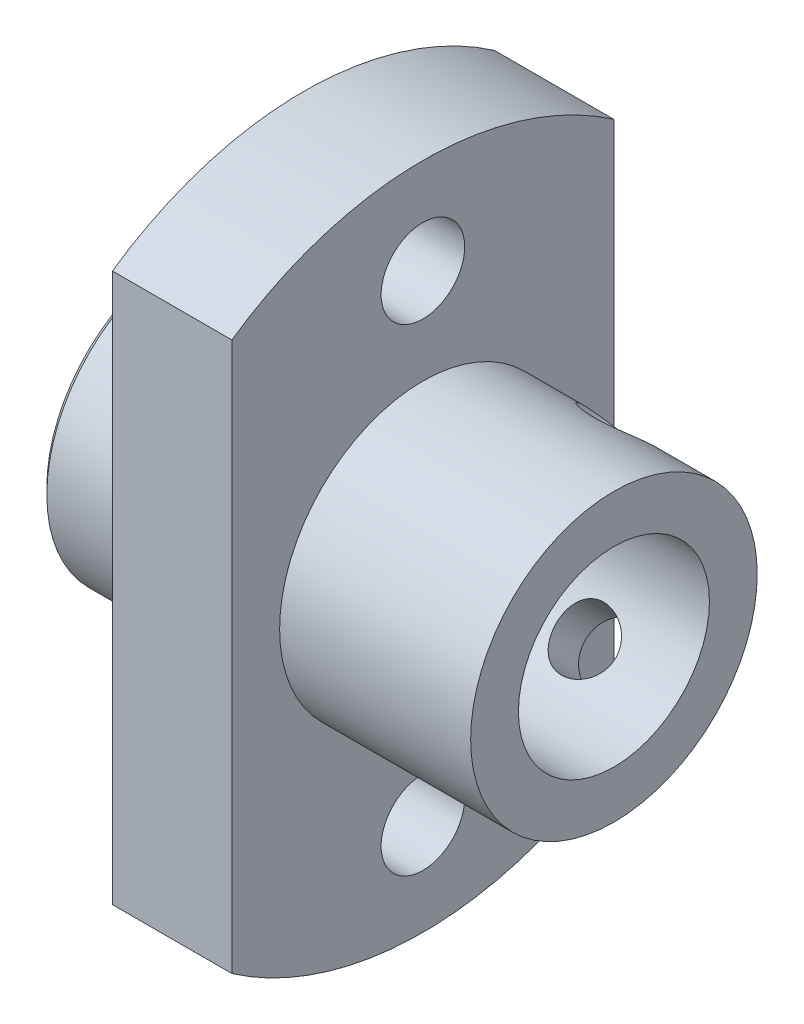
ISO-10303-21;
HEADER;
FILE_DESCRIPTION(('STEP AP214'),'2;1');
FILE_NAME('part.step','',(''),(''),'','','');
FILE_SCHEMA(('AUTOMOTIVE_DESIGN { 1 0 10303 214 1 1 1 1 }'));
ENDSEC;
DATA;
#1=APPLICATION_CONTEXT('core data for automotive mechanical design processes');
#2=APPLICATION_PROTOCOL_DEFINITION('international standard','automotive_design',2000,#1);
#3=PRODUCT_CONTEXT('',#1,'mechanical');
#4=PRODUCT('Part','Part','',(#3));
#5=PRODUCT_RELATED_PRODUCT_CATEGORY('part','',(#4));
#6=PRODUCT_DEFINITION_FORMATION('','',#4);
#7=PRODUCT_DEFINITION_CONTEXT('part definition',#1,'design');
#8=PRODUCT_DEFINITION('design','',#6,#7);
#9=PRODUCT_DEFINITION_SHAPE('','',#8);
#10=(LENGTH_UNIT() NAMED_UNIT(*) SI_UNIT(.MILLI.,.METRE.));
#11=(NAMED_UNIT(*) PLANE_ANGLE_UNIT() SI_UNIT($,.RADIAN.));
#12=(NAMED_UNIT(*) SI_UNIT($,.STERADIAN.) SOLID_ANGLE_UNIT());
#13=UNCERTAINTY_MEASURE_WITH_UNIT(LENGTH_MEASURE(1.E-05),#10,'distance_accuracy_value','');
#14=(GEOMETRIC_REPRESENTATION_CONTEXT(3) GLOBAL_UNCERTAINTY_ASSIGNED_CONTEXT((#13)) GLOBAL_UNIT_ASSIGNED_CONTEXT((#10,
#11,#12)) REPRESENTATION_CONTEXT('',''));
#15=CARTESIAN_POINT('',(0.,0.,0.));
#16=DIRECTION('',(0.,0.,1.));
#17=DIRECTION('',(1.,0.,0.));
#18=AXIS2_PLACEMENT_3D('',#15,#16,#17);
#19=CARTESIAN_POINT('',(5.,14.,0.));
#20=DIRECTION('',(1.,0.,0.));
#21=DIRECTION('',(0.,0.,-1.));
#22=AXIS2_PLACEMENT_3D('',#19,#20,#21);
#23=PLANE('',#22);
#24=CARTESIAN_POINT('',(5.,10.,0.));
#25=DIRECTION('',(1.,0.,0.));
#26=DIRECTION('',(0.,0.,-1.));
#27=AXIS2_PLACEMENT_3D('',#24,#25,#26);
#28=CIRCLE('',#27,1.75000000000001);
#29=CARTESIAN_POINT('',(5.,10.,-1.75000000000001));
#30=VERTEX_POINT('',#29);
#31=EDGE_CURVE('E209',#30,#30,#28,.T.);
#32=ORIENTED_EDGE('',*,*,#31,.T.);
#33=EDGE_LOOP('',(#32));
#34=FACE_BOUND('',#33,.T.);
#35=CARTESIAN_POINT('',(5.,-10.,0.));
#36=DIRECTION('',(1.,0.,0.));
#37=DIRECTION('',(0.,0.,-1.));
#38=AXIS2_PLACEMENT_3D('',#35,#36,#37);
#39=CIRCLE('',#38,1.75000000000001);
#40=CARTESIAN_POINT('',(5.,-10.,-1.75000000000001));
#41=VERTEX_POINT('',#40);
#42=EDGE_CURVE('E217',#41,#41,#39,.T.);
#43=ORIENTED_EDGE('',*,*,#42,.T.);
#44=EDGE_LOOP('',(#43));
#45=FACE_BOUND('',#44,.T.);
#46=CARTESIAN_POINT('',(5.,0.,0.));
#47=DIRECTION('',(-1.,0.,0.));
#48=DIRECTION('',(0.,0.,1.));
#49=AXIS2_PLACEMENT_3D('',#46,#47,#48);
#50=CIRCLE('',#49,5.75);
#51=CARTESIAN_POINT('',(5.,0.,5.75));
#52=VERTEX_POINT('',#51);
#53=EDGE_CURVE('E151',#52,#52,#50,.T.);
#54=ORIENTED_EDGE('',*,*,#53,.F.);
#55=EDGE_LOOP('',(#54));
#56=FACE_BOUND('',#55,.T.);
#57=DIRECTION('',(0.,-1.,0.));
#58=VECTOR('',#57,1.);
#59=CARTESIAN_POINT('',(5.,14.,8.00000000000001));
#60=LINE('',#59,#58);
#61=CARTESIAN_POINT('',(5.,11.4891252930761,8.));
#62=VERTEX_POINT('',#61);
#63=CARTESIAN_POINT('',(5.,-11.4891252930761,8.00000000000001));
#64=VERTEX_POINT('',#63);
#65=EDGE_CURVE('E158',#62,#64,#60,.T.);
#66=ORIENTED_EDGE('',*,*,#65,.F.);
#67=CARTESIAN_POINT('',(5.,0.,0.));
#68=DIRECTION('',(-1.,0.,0.));
#69=DIRECTION('',(0.,0.,1.));
#70=AXIS2_PLACEMENT_3D('',#67,#68,#69);
#71=CIRCLE('',#70,14.);
#72=CARTESIAN_POINT('',(5.,11.4891252930761,-8.00000000000001));
#73=VERTEX_POINT('',#72);
#74=EDGE_CURVE('E111',#62,#73,#71,.T.);
#75=ORIENTED_EDGE('',*,*,#74,.T.);
#76=DIRECTION('',(0.,-1.,0.));
#77=VECTOR('',#76,1.);
#78=CARTESIAN_POINT('',(5.,14.,-8.00000000000001));
#79=LINE('',#78,#77);
#80=CARTESIAN_POINT('',(5.,-11.4891252930761,-8.00000000000001));
#81=VERTEX_POINT('',#80);
#82=EDGE_CURVE('E117',#73,#81,#79,.T.);
#83=ORIENTED_EDGE('',*,*,#82,.T.);
#84=EDGE_CURVE('E102',#81,#64,#71,.T.);
#85=ORIENTED_EDGE('',*,*,#84,.T.);
#86=EDGE_LOOP('',(#66,#75,#83,#85));
#87=FACE_BOUND('',#86,.T.);
#88=ADVANCED_FACE('F47',(#34,#45,#56,#87),#23,.F.);
#89=CARTESIAN_POINT('',(10.,6.,0.));
#90=DIRECTION('',(-1.,0.,0.));
#91=DIRECTION('',(0.,0.,1.));
#92=AXIS2_PLACEMENT_3D('',#89,#90,#91);
#93=PLANE('',#92);
#94=CARTESIAN_POINT('',(10.,10.,0.));
#95=DIRECTION('',(1.,0.,0.));
#96=DIRECTION('',(0.,0.,-1.));
#97=AXIS2_PLACEMENT_3D('',#94,#95,#96);
#98=CIRCLE('',#97,1.75000000000001);
#99=CARTESIAN_POINT('',(10.,10.,-1.75000000000001));
#100=VERTEX_POINT('',#99);
#101=EDGE_CURVE('E204',#100,#100,#98,.T.);
#102=ORIENTED_EDGE('',*,*,#101,.F.);
#103=EDGE_LOOP('',(#102));
#104=FACE_BOUND('',#103,.T.);
#105=CARTESIAN_POINT('',(10.,-10.,0.));
#106=DIRECTION('',(1.,0.,0.));
#107=DIRECTION('',(0.,0.,-1.));
#108=AXIS2_PLACEMENT_3D('',#105,#106,#107);
#109=CIRCLE('',#108,1.75000000000001);
#110=CARTESIAN_POINT('',(10.,-10.,-1.75000000000001));
#111=VERTEX_POINT('',#110);
#112=EDGE_CURVE('E212',#111,#111,#109,.T.);
#113=ORIENTED_EDGE('',*,*,#112,.F.);
#114=EDGE_LOOP('',(#113));
#115=FACE_BOUND('',#114,.T.);
#116=CARTESIAN_POINT('',(10.,0.,0.));
#117=DIRECTION('',(-1.,0.,0.));
#118=DIRECTION('',(0.,0.,1.));
#119=AXIS2_PLACEMENT_3D('',#116,#117,#118);
#120=CIRCLE('',#119,6.);
#121=CARTESIAN_POINT('',(10.,0.,6.));
#122=VERTEX_POINT('',#121);
#123=EDGE_CURVE('E123',#122,#122,#120,.T.);
#124=ORIENTED_EDGE('',*,*,#123,.T.);
#125=EDGE_LOOP('',(#124));
#126=FACE_BOUND('',#125,.T.);
#127=CARTESIAN_POINT('',(10.,0.,0.));
#128=DIRECTION('',(-1.,0.,0.));
#129=DIRECTION('',(0.,0.,1.));
#130=AXIS2_PLACEMENT_3D('',#127,#128,#129);
#131=CIRCLE('',#130,14.);
#132=CARTESIAN_POINT('',(10.,11.4891252930761,8.00000000000001));
#133=VERTEX_POINT('',#132);
#134=CARTESIAN_POINT('',(10.,11.4891252930761,-8.00000000000001));
#135=VERTEX_POINT('',#134);
#136=EDGE_CURVE('E115',#133,#135,#131,.T.);
#137=ORIENTED_EDGE('',*,*,#136,.F.);
#138=DIRECTION('',(0.,-1.,0.));
#139=VECTOR('',#138,1.);
#140=CARTESIAN_POINT('',(10.,0.,8.00000000000001));
#141=LINE('',#140,#139);
#142=CARTESIAN_POINT('',(10.,-11.4891252930761,8.00000000000001));
#143=VERTEX_POINT('',#142);
#144=EDGE_CURVE('E92',#133,#143,#141,.T.);
#145=ORIENTED_EDGE('',*,*,#144,.T.);
#146=CARTESIAN_POINT('',(10.,-11.4891252930761,-8.00000000000001));
#147=VERTEX_POINT('',#146);
#148=EDGE_CURVE('E125',#147,#143,#131,.T.);
#149=ORIENTED_EDGE('',*,*,#148,.F.);
#150=DIRECTION('',(0.,-1.,0.));
#151=VECTOR('',#150,1.);
#152=CARTESIAN_POINT('',(10.,0.,-8.00000000000001));
#153=LINE('',#152,#151);
#154=EDGE_CURVE('E104',#135,#147,#153,.T.);
#155=ORIENTED_EDGE('',*,*,#154,.F.);
#156=EDGE_LOOP('',(#137,#145,#149,#155));
#157=FACE_BOUND('',#156,.T.);
#158=ADVANCED_FACE('F119',(#104,#115,#126,#157),#93,.F.);
#159=CARTESIAN_POINT('',(0.,0.,0.));
#160=DIRECTION('',(-1.,0.,0.));
#161=DIRECTION('',(0.,0.,1.));
#162=AXIS2_PLACEMENT_3D('',#159,#160,#161);
#163=CYLINDRICAL_SURFACE('',#162,14.);
#164=DIRECTION('',(1.,0.,0.));
#165=VECTOR('',#164,1.);
#166=CARTESIAN_POINT('',(0.,-11.4891252930761,8.00000000000001));
#167=LINE('',#166,#165);
#168=EDGE_CURVE('E98',#64,#143,#167,.T.);
#169=ORIENTED_EDGE('',*,*,#168,.F.);
#170=ORIENTED_EDGE('',*,*,#84,.F.);
#171=DIRECTION('',(1.,0.,0.));
#172=VECTOR('',#171,1.);
#173=CARTESIAN_POINT('',(0.,-11.4891252930761,-8.00000000000001));
#174=LINE('',#173,#172);
#175=EDGE_CURVE('E72',#81,#147,#174,.T.);
#176=ORIENTED_EDGE('',*,*,#175,.T.);
#177=ORIENTED_EDGE('',*,*,#148,.T.);
#178=EDGE_LOOP('',(#169,#170,#176,#177));
#179=FACE_BOUND('',#178,.T.);
#180=ADVANCED_FACE('F232',(#179),#163,.T.);
#181=CARTESIAN_POINT('',(0.,0.,0.));
#182=DIRECTION('',(-1.,0.,0.));
#183=DIRECTION('',(0.,0.,1.));
#184=AXIS2_PLACEMENT_3D('',#181,#182,#183);
#185=CYLINDRICAL_SURFACE('',#184,5.75);
#186=CARTESIAN_POINT('',(4.5,0.,0.));
#187=DIRECTION('',(-1.,0.,0.));
#188=DIRECTION('',(0.,0.,1.));
#189=AXIS2_PLACEMENT_3D('',#186,#187,#188);
#190=CIRCLE('',#189,5.75);
#191=CARTESIAN_POINT('',(4.5,0.,5.75));
#192=VERTEX_POINT('',#191);
#193=EDGE_CURVE('E150',#192,#192,#190,.T.);
#194=ORIENTED_EDGE('',*,*,#193,.F.);
#195=EDGE_LOOP('',(#194));
#196=FACE_BOUND('',#195,.T.);
#197=ORIENTED_EDGE('',*,*,#53,.T.);
#198=EDGE_LOOP('',(#197));
#199=FACE_BOUND('',#198,.T.);
#200=ADVANCED_FACE('F240',(#196,#199),#185,.T.);
#201=CARTESIAN_POINT('',(4.5,6.,0.));
#202=DIRECTION('',(-1.,0.,0.));
#203=DIRECTION('',(0.,0.,1.));
#204=AXIS2_PLACEMENT_3D('',#201,#202,#203);
#205=PLANE('',#204);
#206=CARTESIAN_POINT('',(4.5,0.,0.));
#207=DIRECTION('',(-1.,0.,0.));
#208=DIRECTION('',(0.,0.,1.));
#209=AXIS2_PLACEMENT_3D('',#206,#207,#208);
#210=CIRCLE('',#209,6.);
#211=CARTESIAN_POINT('',(4.5,0.,6.));
#212=VERTEX_POINT('',#211);
#213=EDGE_CURVE('E141',#212,#212,#210,.T.);
#214=ORIENTED_EDGE('',*,*,#213,.F.);
#215=EDGE_LOOP('',(#214));
#216=FACE_BOUND('',#215,.T.);
#217=ORIENTED_EDGE('',*,*,#193,.T.);
#218=EDGE_LOOP('',(#217));
#219=FACE_BOUND('',#218,.T.);
#220=ADVANCED_FACE('F244',(#216,#219),#205,.F.);
#221=CARTESIAN_POINT('',(0.,0.,0.));
#222=DIRECTION('',(-1.,0.,0.));
#223=DIRECTION('',(0.,0.,1.));
#224=AXIS2_PLACEMENT_3D('',#221,#222,#223);
#225=CYLINDRICAL_SURFACE('',#224,6.);
#226=CARTESIAN_POINT('',(0.25,0.,0.));
#227=DIRECTION('',(1.,0.,0.));
#228=DIRECTION('',(0.,0.,-1.));
#229=AXIS2_PLACEMENT_3D('',#226,#227,#228);
#230=CIRCLE('',#229,6.);
#231=CARTESIAN_POINT('',(0.25,0.,-6.));
#232=VERTEX_POINT('',#231);
#233=EDGE_CURVE('E164',#232,#232,#230,.T.);
#234=ORIENTED_EDGE('',*,*,#233,.T.);
#235=EDGE_LOOP('',(#234));
#236=FACE_BOUND('',#235,.T.);
#237=ORIENTED_EDGE('',*,*,#213,.T.);
#238=EDGE_LOOP('',(#237));
#239=FACE_BOUND('',#238,.T.);
#240=ADVANCED_FACE('F259',(#236,#239),#225,.T.);
#241=CARTESIAN_POINT('',(0.,6.,0.));
#242=DIRECTION('',(1.,0.,0.));
#243=DIRECTION('',(0.,0.,-1.));
#244=AXIS2_PLACEMENT_3D('',#241,#242,#243);
#245=PLANE('',#244);
#246=CARTESIAN_POINT('',(0.,0.,0.));
#247=DIRECTION('',(1.,0.,0.));
#248=DIRECTION('',(0.,0.,-1.));
#249=AXIS2_PLACEMENT_3D('',#246,#247,#248);
#250=CIRCLE('',#249,5.75);
#251=CARTESIAN_POINT('',(0.,0.,-5.75));
#252=VERTEX_POINT('',#251);
#253=EDGE_CURVE('E161',#252,#252,#250,.F.);
#254=ORIENTED_EDGE('',*,*,#253,.T.);
#255=EDGE_LOOP('',(#254));
#256=FACE_BOUND('',#255,.T.);
#257=CARTESIAN_POINT('',(0.,0.,0.));
#258=DIRECTION('',(-1.,0.,0.));
#259=DIRECTION('',(0.,0.,1.));
#260=AXIS2_PLACEMENT_3D('',#257,#258,#259);
#261=CIRCLE('',#260,4.);
#262=CARTESIAN_POINT('',(0.,0.,4.));
#263=VERTEX_POINT('',#262);
#264=EDGE_CURVE('E139',#263,#263,#261,.T.);
#265=ORIENTED_EDGE('',*,*,#264,.F.);
#266=EDGE_LOOP('',(#265));
#267=FACE_BOUND('',#266,.T.);
#268=ADVANCED_FACE('F263',(#256,#267),#245,.F.);
#269=CARTESIAN_POINT('',(0.,0.,0.));
#270=DIRECTION('',(-1.,0.,0.));
#271=DIRECTION('',(0.,0.,1.));
#272=AXIS2_PLACEMENT_3D('',#269,#270,#271);
#273=CYLINDRICAL_SURFACE('',#272,4.);
#274=CARTESIAN_POINT('',(14.,-1.80288968104244,-3.57065663400875));
#275=CARTESIAN_POINT('',(14.0683470361093,-1.80289030571911,-3.57065660503658));
#276=CARTESIAN_POINT('',(14.1366987687032,-1.80818512505603,-3.56799767532857));
#277=CARTESIAN_POINT('',(14.2713941608778,-1.82904810475375,-3.55734683774358));
#278=CARTESIAN_POINT('',(14.3377372727322,-1.84461904136233,-3.54935348868634));
#279=CARTESIAN_POINT('',(14.466444901932,-1.88511945936262,-3.52800835980024));
#280=CARTESIAN_POINT('',(14.5288162331057,-1.91003237873335,-3.51466606003217));
#281=CARTESIAN_POINT('',(14.648152695864,-1.96797357521107,-3.48255266033087));
#282=CARTESIAN_POINT('',(14.7051168699601,-2.00100328592067,-3.46378060127978));
#283=CARTESIAN_POINT('',(14.8139788674935,-2.07486710927881,-3.4200614928288));
#284=CARTESIAN_POINT('',(14.865663609436,-2.11591227360753,-3.39494031262977));
#285=CARTESIAN_POINT('',(14.9605960132092,-2.20340159015236,-3.33881998496428));
#286=CARTESIAN_POINT('',(15.0038424969448,-2.24984649480285,-3.30782001792928));
#287=CARTESIAN_POINT('',(15.0816110630112,-2.34745989554556,-3.23929961377753));
#288=CARTESIAN_POINT('',(15.1159137038315,-2.39871146718136,-3.20164756060609));
#289=CARTESIAN_POINT('',(15.1733760498555,-2.50303163514914,-3.12076610535235));
#290=CARTESIAN_POINT('',(15.1965383741496,-2.55609980125372,-3.07753801723052));
#291=CARTESIAN_POINT('',(15.2303511280971,-2.66042378700507,-2.98776381983245));
#292=CARTESIAN_POINT('',(15.2413657497878,-2.71168497913297,-2.94136134455498));
#293=CARTESIAN_POINT('',(15.2517243464375,-2.81230165697308,-2.84531055266677));
#294=CARTESIAN_POINT('',(15.2510709743588,-2.86165757333198,-2.79566297645538));
#295=CARTESIAN_POINT('',(15.238351708414,-2.95531435483259,-2.69640794179046));
#296=CARTESIAN_POINT('',(15.226680616487,-2.99973091540503,-2.64685827869325));
#297=CARTESIAN_POINT('',(15.192905009957,-3.08436293146338,-2.5477352629929));
#298=CARTESIAN_POINT('',(15.1707998149134,-3.12457811275522,-2.49816190905547));
#299=CARTESIAN_POINT('',(15.1165298109251,-3.20058640425909,-2.40003107341511));
#300=CARTESIAN_POINT('',(15.084245191437,-3.23631936757298,-2.3514934512199));
#301=CARTESIAN_POINT('',(15.0106289002954,-3.30241475894965,-2.25773164911935));
#302=CARTESIAN_POINT('',(14.9692949408622,-3.33277582541756,-2.21250831097));
#303=CARTESIAN_POINT('',(14.8767263651987,-3.389144704395,-2.12520873003737));
#304=CARTESIAN_POINT('',(14.8251509311588,-3.41491836698349,-2.08334218337763));
#305=CARTESIAN_POINT('',(14.7146048981755,-3.46050697518938,-2.00670993923054));
#306=CARTESIAN_POINT('',(14.655633429425,-3.48032121901926,-1.97194507819979));
#307=CARTESIAN_POINT('',(14.5310825311402,-3.51425926671764,-1.91081735332639));
#308=CARTESIAN_POINT('',(14.4654365909576,-3.52831696946609,-1.88455277719453));
#309=CARTESIAN_POINT('',(14.3299405081046,-3.55049551670868,-1.84243176789487));
#310=CARTESIAN_POINT('',(14.2600918857895,-3.55861849432836,-1.82657159526906));
#311=CARTESIAN_POINT('',(14.1211800474342,-3.5687753392117,-1.80664423679707));
#312=CARTESIAN_POINT('',(14.0521980037679,-3.57104071252129,-1.80212889210537));
#313=CARTESIAN_POINT('',(13.9144102585018,-3.57016673715856,-1.80386003750099));
#314=CARTESIAN_POINT('',(13.8456045312995,-3.56702822361113,-1.81010486469508));
#315=CARTESIAN_POINT('',(13.7121917033484,-3.55550140639484,-1.83263752282806));
#316=CARTESIAN_POINT('',(13.647520725926,-3.54726753164827,-1.84862972536123));
#317=CARTESIAN_POINT('',(13.521978208004,-3.52564615598807,-1.88953720131367));
#318=CARTESIAN_POINT('',(13.4611072890788,-3.51225781451319,-1.91445393004796));
#319=CARTESIAN_POINT('',(13.3429608902283,-3.4798001051782,-1.97284933775562));
#320=CARTESIAN_POINT('',(13.2858385844072,-3.46057882627758,-2.00655306632047));
#321=CARTESIAN_POINT('',(13.1785096536381,-3.41653483389054,-2.08065963963097));
#322=CARTESIAN_POINT('',(13.1283048310747,-3.39171066497126,-2.12106422429772));
#323=CARTESIAN_POINT('',(13.0340896340872,-3.33529174721352,-2.20876748108082));
#324=CARTESIAN_POINT('',(12.9904222138601,-3.30345903684159,-2.25628247243922));
#325=CARTESIAN_POINT('',(12.9131089566787,-3.23384124277099,-2.35497603855302));
#326=CARTESIAN_POINT('',(12.879462660689,-3.19605643184015,-2.40615444536592));
#327=CARTESIAN_POINT('',(12.8234694375283,-3.1152781728554,-2.50984553563265));
#328=CARTESIAN_POINT('',(12.8010407121563,-3.07232535134571,-2.56234553800171));
#329=CARTESIAN_POINT('',(12.7679274614103,-2.98184078610164,-2.66709729901053));
#330=CARTESIAN_POINT('',(12.7572392609165,-2.93431048032078,-2.71934913023257));
#331=CARTESIAN_POINT('',(12.7482089982504,-2.83800345116101,-2.81963997764553));
#332=CARTESIAN_POINT('',(12.7493715498292,-2.78936096151418,-2.86776381865191));
#333=CARTESIAN_POINT('',(12.7628118110487,-2.6904964427738,-2.96071478462393));
#334=CARTESIAN_POINT('',(12.775088795992,-2.64027451687073,-3.00554212432618));
#335=CARTESIAN_POINT('',(12.8100940092223,-2.54052194488809,-3.09030470588553));
#336=CARTESIAN_POINT('',(12.8326896078454,-2.49099050870454,-3.13029411952677));
#337=CARTESIAN_POINT('',(12.8875708272085,-2.39361375144726,-3.20537010957023));
#338=CARTESIAN_POINT('',(12.9198581099734,-2.34576872114874,-3.24045584352771));
#339=CARTESIAN_POINT('',(12.9944727583444,-2.25180790129064,-3.30647420461506));
#340=CARTESIAN_POINT('',(13.037103522464,-2.20580580858097,-3.33722560024325));
#341=CARTESIAN_POINT('',(13.1306598894435,-2.11903396615902,-3.39298694662355));
#342=CARTESIAN_POINT('',(13.1815879741394,-2.07826578852223,-3.41799517411017));
#343=CARTESIAN_POINT('',(13.2923157198411,-2.00237810045469,-3.46301839777919));
#344=CARTESIAN_POINT('',(13.3523534031166,-1.96749048567916,-3.48284051265675));
#345=CARTESIAN_POINT('',(13.4783981202691,-1.90678170331302,-3.51644623739546));
#346=CARTESIAN_POINT('',(13.5444027264503,-1.8809568691413,-3.53023228986131));
#347=CARTESIAN_POINT('',(13.6747226173147,-1.84155623262106,-3.55093285934443));
#348=CARTESIAN_POINT('',(13.7387025474516,-1.8271241492854,-3.55833283084341));
#349=CARTESIAN_POINT('',(13.8684538320965,-1.80779174707742,-3.56819412374839));
#350=CARTESIAN_POINT('',(13.9342247412015,-1.80288907987124,-3.57065666189075));
#351=CARTESIAN_POINT('',(14.,-1.80288968104244,-3.57065663400875));
#352=B_SPLINE_CURVE_WITH_KNOTS('',3,(#274,#275,#276,#277,#278,#279,#280,#281,#282,#283,#284,
#285,#286,#287,#288,#289,#290,#291,#292,#293,#294,#295,#296,#297,#298,#299,#300,#301,#302,#303,
#304,#305,#306,#307,#308,#309,#310,#311,#312,#313,#314,#315,#316,#317,#318,#319,#320,#321,#322,
#323,#324,#325,#326,#327,#328,#329,#330,#331,#332,#333,#334,#335,#336,#337,#338,#339,#340,#341,
#342,#343,#344,#345,#346,#347,#348,#349,#350,#351),.UNSPECIFIED.,.T.,.F.,(4,2,2,2,2,2,2,2,2,2,2,
2,2,2,2,2,2,2,2,2,2,2,2,2,2,2,2,2,2,2,2,2,2,2,2,2,2,2,4),(0.,0.204798137548489,
0.409651627059734,0.614143644118575,0.818671804924945,1.02957080550838,1.24049922941122,
1.45619821963732,1.67184647417921,1.88083722835533,2.08978046471773,2.29150982969749,
2.49325235190092,2.69746404608408,2.90172742713186,3.11450338937332,3.32730439853774,
3.54248470934453,3.75758763952751,3.96404933287934,4.17047912219087,4.37093972044361,
4.57143302253208,4.77767613309608,4.98397288011878,5.19881937811509,5.41365603317084,
5.62690239290995,5.84008198140582,6.04438802439522,6.24868074692303,6.45041846514756,
6.65219079911649,6.86080693105212,7.06948557772187,7.28507795501701,7.50058300803818,
7.69772354371382,7.89481549188775),.UNSPECIFIED.);
#353=CARTESIAN_POINT('',(14.,-1.80288968104244,-3.57065663400875));
#354=VERTEX_POINT('',#353);
#355=EDGE_CURVE('E307',#354,#354,#352,.T.);
#356=ORIENTED_EDGE('',*,*,#355,.T.);
#357=EDGE_LOOP('',(#356));
#358=FACE_BOUND('',#357,.T.);
#359=CARTESIAN_POINT('',(14.,3.57065663400877,-1.80288968104239));
#360=CARTESIAN_POINT('',(14.0683470361093,3.5706566050366,-1.80289030571907));
#361=CARTESIAN_POINT('',(14.1366987687032,3.5679976753286,-1.80818512505599));
#362=CARTESIAN_POINT('',(14.2713941608778,3.5573468377436,-1.8290481047537));
#363=CARTESIAN_POINT('',(14.3377372727322,3.54935348868636,-1.84461904136229));
#364=CARTESIAN_POINT('',(14.466444901932,3.52800835980026,-1.88511945936258));
#365=CARTESIAN_POINT('',(14.5288162331057,3.51466606003219,-1.91003237873331));
#366=CARTESIAN_POINT('',(14.648152695864,3.4825526603309,-1.96797357521103));
#367=CARTESIAN_POINT('',(14.7051168699601,3.4637806012798,-2.00100328592063));
#368=CARTESIAN_POINT('',(14.8139788674935,3.42006149282882,-2.07486710927877));
#369=CARTESIAN_POINT('',(14.865663609436,3.39494031262979,-2.11591227360748));
#370=CARTESIAN_POINT('',(14.9605960132092,3.33881998496431,-2.20340159015232));
#371=CARTESIAN_POINT('',(15.0038424969448,3.30782001792931,-2.24984649480281));
#372=CARTESIAN_POINT('',(15.0816110630112,3.23929961377756,-2.34745989554552));
#373=CARTESIAN_POINT('',(15.1159137038315,3.20164756060612,-2.39871146718132));
#374=CARTESIAN_POINT('',(15.1733760498555,3.12076610535238,-2.50303163514911));
#375=CARTESIAN_POINT('',(15.1965383741496,3.07753801723056,-2.55609980125368));
#376=CARTESIAN_POINT('',(15.2303511280971,2.98776381983248,-2.66042378700504));
#377=CARTESIAN_POINT('',(15.2413657497878,2.94136134455501,-2.71168497913294));
#378=CARTESIAN_POINT('',(15.2517243464375,2.8453105526668,-2.81230165697305));
#379=CARTESIAN_POINT('',(15.2510709743588,2.79566297645541,-2.86165757333195));
#380=CARTESIAN_POINT('',(15.238351708414,2.6964079417905,-2.95531435483255));
#381=CARTESIAN_POINT('',(15.226680616487,2.64685827869328,-2.999730915405));
#382=CARTESIAN_POINT('',(15.192905009957,2.54773526299293,-3.08436293146335));
#383=CARTESIAN_POINT('',(15.1707998149134,2.49816190905551,-3.12457811275519));
#384=CARTESIAN_POINT('',(15.1165298109251,2.40003107341515,-3.20058640425906));
#385=CARTESIAN_POINT('',(15.084245191437,2.35149345121994,-3.23631936757295));
#386=CARTESIAN_POINT('',(15.0106289002954,2.25773164911939,-3.30241475894962));
#387=CARTESIAN_POINT('',(14.9692949408622,2.21250831097004,-3.33277582541754));
#388=CARTESIAN_POINT('',(14.8767263651987,2.12520873003741,-3.38914470439498));
#389=CARTESIAN_POINT('',(14.8251509311588,2.08334218337767,-3.41491836698347));
#390=CARTESIAN_POINT('',(14.7146048981755,2.00670993923058,-3.46050697518936));
#391=CARTESIAN_POINT('',(14.655633429425,1.97194507819983,-3.48032121901924));
#392=CARTESIAN_POINT('',(14.5310825311402,1.91081735332643,-3.51425926671762));
#393=CARTESIAN_POINT('',(14.4654365909576,1.88455277719457,-3.52831696946606));
#394=CARTESIAN_POINT('',(14.3299405081046,1.84243176789491,-3.55049551670866));
#395=CARTESIAN_POINT('',(14.2600918857895,1.82657159526911,-3.55861849432834));
#396=CARTESIAN_POINT('',(14.1211800474342,1.80664423679711,-3.56877533921168));
#397=CARTESIAN_POINT('',(14.0521980037679,1.80212889210542,-3.57104071252127));
#398=CARTESIAN_POINT('',(13.9144102585018,1.80386003750103,-3.57016673715854));
#399=CARTESIAN_POINT('',(13.8456045312995,1.81010486469512,-3.56702822361111));
#400=CARTESIAN_POINT('',(13.7121917033484,1.8326375228281,-3.55550140639482));
#401=CARTESIAN_POINT('',(13.647520725926,1.84862972536128,-3.54726753164824));
#402=CARTESIAN_POINT('',(13.521978208004,1.88953720131372,-3.52564615598805));
#403=CARTESIAN_POINT('',(13.4611072890788,1.914453930048,-3.51225781451317));
#404=CARTESIAN_POINT('',(13.3429608902283,1.97284933775566,-3.47980010517817));
#405=CARTESIAN_POINT('',(13.2858385844072,2.00655306632051,-3.46057882627756));
#406=CARTESIAN_POINT('',(13.1785096536381,2.08065963963101,-3.41653483389052));
#407=CARTESIAN_POINT('',(13.1283048310747,2.12106422429776,-3.39171066497124));
#408=CARTESIAN_POINT('',(13.0340896340872,2.20876748108086,-3.3352917472135));
#409=CARTESIAN_POINT('',(12.9904222138601,2.25628247243926,-3.30345903684156));
#410=CARTESIAN_POINT('',(12.9131089566787,2.35497603855306,-3.23384124277097));
#411=CARTESIAN_POINT('',(12.879462660689,2.40615444536596,-3.19605643184012));
#412=CARTESIAN_POINT('',(12.8234694375283,2.50984553563269,-3.11527817285537));
#413=CARTESIAN_POINT('',(12.8010407121563,2.56234553800175,-3.07232535134568));
#414=CARTESIAN_POINT('',(12.7679274614103,2.66709729901057,-2.9818407861016));
#415=CARTESIAN_POINT('',(12.7572392609165,2.71934913023261,-2.93431048032075));
#416=CARTESIAN_POINT('',(12.7482089982504,2.81963997764557,-2.83800345116097));
#417=CARTESIAN_POINT('',(12.7493715498292,2.86776381865194,-2.78936096151415));
#418=CARTESIAN_POINT('',(12.7628118110487,2.96071478462396,-2.69049644277376));
#419=CARTESIAN_POINT('',(12.775088795992,3.00554212432621,-2.64027451687069));
#420=CARTESIAN_POINT('',(12.8100940092223,3.09030470588556,-2.54052194488805));
#421=CARTESIAN_POINT('',(12.8326896078454,3.1302941195268,-2.4909905087045));
#422=CARTESIAN_POINT('',(12.8875708272085,3.20537010957026,-2.39361375144722));
#423=CARTESIAN_POINT('',(12.9198581099734,3.24045584352774,-2.3457687211487));
#424=CARTESIAN_POINT('',(12.9944727583444,3.30647420461509,-2.2518079012906));
#425=CARTESIAN_POINT('',(13.037103522464,3.33722560024328,-2.20580580858093));
#426=CARTESIAN_POINT('',(13.1306598894435,3.39298694662357,-2.11903396615898));
#427=CARTESIAN_POINT('',(13.1815879741394,3.4179951741102,-2.07826578852219));
#428=CARTESIAN_POINT('',(13.2923157198411,3.46301839777921,-2.00237810045465));
#429=CARTESIAN_POINT('',(13.3523534031166,3.48284051265678,-1.96749048567912));
#430=CARTESIAN_POINT('',(13.4783981202691,3.51644623739548,-1.90678170331298));
#431=CARTESIAN_POINT('',(13.5444027264503,3.53023228986134,-1.88095686914125));
#432=CARTESIAN_POINT('',(13.6747226173147,3.55093285934446,-1.84155623262102));
#433=CARTESIAN_POINT('',(13.7387025474516,3.55833283084343,-1.82712414928535));
#434=CARTESIAN_POINT('',(13.8684538320965,3.56819412374841,-1.80779174707738));
#435=CARTESIAN_POINT('',(13.9342247412015,3.57065666189077,-1.80288907987119));
#436=CARTESIAN_POINT('',(14.,3.57065663400877,-1.80288968104239));
#437=B_SPLINE_CURVE_WITH_KNOTS('',3,(#359,#360,#361,#362,#363,#364,#365,#366,#367,#368,#369,
#370,#371,#372,#373,#374,#375,#376,#377,#378,#379,#380,#381,#382,#383,#384,#385,#386,#387,#388,
#389,#390,#391,#392,#393,#394,#395,#396,#397,#398,#399,#400,#401,#402,#403,#404,#405,#406,#407,
#408,#409,#410,#411,#412,#413,#414,#415,#416,#417,#418,#419,#420,#421,#422,#423,#424,#425,#426,
#427,#428,#429,#430,#431,#432,#433,#434,#435,#436),.UNSPECIFIED.,.T.,.F.,(4,2,2,2,2,2,2,2,2,2,2,
2,2,2,2,2,2,2,2,2,2,2,2,2,2,2,2,2,2,2,2,2,2,2,2,2,2,2,4),(0.,0.204798137548489,
0.409651627059734,0.614143644118578,0.818671804924944,1.02957080550838,1.24049922941122,
1.45619821963732,1.67184647417921,1.88083722835533,2.08978046471774,2.29150982969749,
2.49325235190092,2.69746404608408,2.90172742713186,3.11450338937333,3.32730439853774,
3.54248470934452,3.75758763952751,3.96404933287934,4.17047912219087,4.37093972044361,
4.57143302253208,4.77767613309608,4.98397288011878,5.19881937811509,5.41365603317084,
5.62690239290995,5.84008198140582,6.04438802439522,6.24868074692304,6.45041846514756,
6.65219079911649,6.86080693105212,7.06948557772187,7.28507795501701,7.50058300803819,
7.69772354371382,7.89481549188775),.UNSPECIFIED.);
#438=CARTESIAN_POINT('',(14.,3.57065663400877,-1.80288968104239));
#439=VERTEX_POINT('',#438);
#440=EDGE_CURVE('E198',#439,#439,#437,.T.);
#441=ORIENTED_EDGE('',*,*,#440,.T.);
#442=EDGE_LOOP('',(#441));
#443=FACE_BOUND('',#442,.T.);
#444=CARTESIAN_POINT('',(18.,0.,0.));
#445=DIRECTION('',(-1.,0.,0.));
#446=DIRECTION('',(0.,0.,1.));
#447=AXIS2_PLACEMENT_3D('',#444,#445,#446);
#448=CIRCLE('',#447,4.);
#449=CARTESIAN_POINT('',(18.,0.,4.));
#450=VERTEX_POINT('',#449);
#451=EDGE_CURVE('E131',#450,#450,#448,.T.);
#452=ORIENTED_EDGE('',*,*,#451,.F.);
#453=EDGE_LOOP('',(#452));
#454=FACE_BOUND('',#453,.T.);
#455=ORIENTED_EDGE('',*,*,#264,.T.);
#456=EDGE_LOOP('',(#455));
#457=FACE_BOUND('',#456,.T.);
#458=ADVANCED_FACE('F270',(#358,#443,#454,#457),#273,.F.);
#459=CARTESIAN_POINT('',(18.,4.,0.));
#460=DIRECTION('',(-1.,0.,0.));
#461=DIRECTION('',(0.,0.,1.));
#462=AXIS2_PLACEMENT_3D('',#459,#460,#461);
#463=PLANE('',#462);
#464=CARTESIAN_POINT('',(18.,0.,0.));
#465=DIRECTION('',(-1.,0.,0.));
#466=DIRECTION('',(0.,0.,1.));
#467=AXIS2_PLACEMENT_3D('',#464,#465,#466);
#468=CIRCLE('',#467,6.);
#469=CARTESIAN_POINT('',(18.,0.,6.));
#470=VERTEX_POINT('',#469);
#471=EDGE_CURVE('E130',#470,#470,#468,.T.);
#472=ORIENTED_EDGE('',*,*,#471,.F.);
#473=EDGE_LOOP('',(#472));
#474=FACE_BOUND('',#473,.T.);
#475=ORIENTED_EDGE('',*,*,#451,.T.);
#476=EDGE_LOOP('',(#475));
#477=FACE_BOUND('',#476,.T.);
#478=ADVANCED_FACE('F269',(#474,#477),#463,.F.);
#479=CARTESIAN_POINT('',(0.,0.,0.));
#480=DIRECTION('',(-1.,0.,0.));
#481=DIRECTION('',(0.,0.,1.));
#482=AXIS2_PLACEMENT_3D('',#479,#480,#481);
#483=CYLINDRICAL_SURFACE('',#482,6.);
#484=CARTESIAN_POINT('',(12.475,-4.24264068711932,-4.24264068711926));
#485=CARTESIAN_POINT('',(12.4750069934829,-4.29649487736657,-4.18878276442551));
#486=CARTESIAN_POINT('',(12.4822051871316,-4.34936682615171,-4.13383572869895));
#487=CARTESIAN_POINT('',(12.5105723024422,-4.45126273390648,-4.02391637717558));
#488=CARTESIAN_POINT('',(12.5317605076217,-4.50028127691605,-3.96894413129313));
#489=CARTESIAN_POINT('',(12.5839016836939,-4.58817866756376,-3.86686793220988));
#490=CARTESIAN_POINT('',(12.6135719042352,-4.62758135837864,-3.81955018364791));
#491=CARTESIAN_POINT('',(12.6818526474262,-4.7017374380698,-3.72788718241509));
#492=CARTESIAN_POINT('',(12.7204602687891,-4.73649232996507,-3.68354097112556));
#493=CARTESIAN_POINT('',(12.8092699369601,-4.80412276091069,-3.59496769802041));
#494=CARTESIAN_POINT('',(12.8602120916672,-4.83653087336774,-3.551127305234));
#495=CARTESIAN_POINT('',(12.9696490768777,-4.89552403664583,-3.46935040196488));
#496=CARTESIAN_POINT('',(13.0281481819462,-4.92210576866742,-3.43141725988962));
#497=CARTESIAN_POINT('',(13.1581461540041,-4.97222236951421,-3.35844977396029));
#498=CARTESIAN_POINT('',(13.230366982048,-4.99507206725753,-3.32422920414476));
#499=CARTESIAN_POINT('',(13.3802998903098,-5.03385873973446,-3.265197695839));
#500=CARTESIAN_POINT('',(13.4580139458864,-5.04979321290331,-3.24039016289782));
#501=CARTESIAN_POINT('',(13.6233863620342,-5.07592079455676,-3.19932416074576));
#502=CARTESIAN_POINT('',(13.7113433466862,-5.08555411842498,-3.18390611221131));
#503=CARTESIAN_POINT('',(13.8890457907641,-5.09708305885499,-3.16541669613487));
#504=CARTESIAN_POINT('',(13.9787915532369,-5.0989773529128,-3.16234743884913));
#505=CARTESIAN_POINT('',(14.1602725038426,-5.09499596364105,-3.16875895542456));
#506=CARTESIAN_POINT('',(14.2519901980256,-5.0888940675162,-3.17860511516056));
#507=CARTESIAN_POINT('',(14.4321898137295,-5.06843200291604,-3.2111309596247));
#508=CARTESIAN_POINT('',(14.5206712679004,-5.05407064664957,-3.23381249019723));
#509=CARTESIAN_POINT('',(14.691577474148,-5.0169330219237,-3.29113081493558));
#510=CARTESIAN_POINT('',(14.7740161883701,-4.99417693515528,-3.32573892350166));
#511=CARTESIAN_POINT('',(14.9304197887214,-4.93997052941727,-3.40573299223225));
#512=CARTESIAN_POINT('',(15.0043847459712,-4.90852028342575,-3.45111886192863));
#513=CARTESIAN_POINT('',(15.1381057142371,-4.83823216783092,-3.54893999614656));
#514=CARTESIAN_POINT('',(15.1983295200771,-4.79976193404268,-3.6009970918172));
#515=CARTESIAN_POINT('',(15.3056632213331,-4.71472203162242,-3.71163546514876));
#516=CARTESIAN_POINT('',(15.3527848076127,-4.66815964415332,-3.77021086087158));
#517=CARTESIAN_POINT('',(15.4271026696895,-4.57287770019302,-3.88506821432175));
#518=CARTESIAN_POINT('',(15.4558725191202,-4.52489910615253,-3.94094425894632));
#519=CARTESIAN_POINT('',(15.4990889765203,-4.42406407870007,-4.05380764284068));
#520=CARTESIAN_POINT('',(15.5135495278116,-4.3712124487114,-4.11079384500969));
#521=CARTESIAN_POINT('',(15.5264506268582,-4.26858346595816,-4.21711123386182));
#522=CARTESIAN_POINT('',(15.5265300200299,-4.21914285421698,-4.26657429213595));
#523=CARTESIAN_POINT('',(15.5147429398753,-4.11930867049253,-4.36303903476544));
#524=CARTESIAN_POINT('',(15.5028786761209,-4.06891527646562,-4.4100411726981));
#525=CARTESIAN_POINT('',(15.4684094146338,-3.97045009648226,-4.49886497058695));
#526=CARTESIAN_POINT('',(15.4461702967664,-3.92235644729976,-4.54080613243264));
#527=CARTESIAN_POINT('',(15.3920849247309,-3.82816114237296,-4.62049710974208));
#528=CARTESIAN_POINT('',(15.3602367485809,-3.78205988725373,-4.65824608462573));
#529=CARTESIAN_POINT('',(15.2857781232508,-3.69016416623889,-4.73142279658667));
#530=CARTESIAN_POINT('',(15.2426052484123,-3.6445819919853,-4.76654295133256));
#531=CARTESIAN_POINT('',(15.1481865669609,-3.55819689685161,-4.83137225375719));
#532=CARTESIAN_POINT('',(15.0969373173689,-3.51739602724745,-4.86107908202121));
#533=CARTESIAN_POINT('',(14.9816648316346,-3.43726512033567,-4.9181190693426));
#534=CARTESIAN_POINT('',(14.9168536210067,-3.39861292946394,-4.9448126228808));
#535=CARTESIAN_POINT('',(14.7808521712598,-3.32942612766421,-4.99166011389242));
#536=CARTESIAN_POINT('',(14.7096592221618,-3.29889498734901,-5.01181125620935));
#537=CARTESIAN_POINT('',(14.5555089454571,-3.24423326645169,-5.04738767448684));
#538=CARTESIAN_POINT('',(14.4720798545364,-3.22100793817699,-5.06216695003847));
#539=CARTESIAN_POINT('',(14.3018891833712,-3.18604968567648,-5.08424190280142));
#540=CARTESIAN_POINT('',(14.215126807339,-3.1743195237458,-5.09153578128739));
#541=CARTESIAN_POINT('',(14.0365011080666,-3.16248189906629,-5.09889837617329));
#542=CARTESIAN_POINT('',(13.9445859657813,-3.16293050391452,-5.09862141340192));
#543=CARTESIAN_POINT('',(13.7621185057641,-3.17681798201099,-5.08997952803073));
#544=CARTESIAN_POINT('',(13.6715663631343,-3.19025851008608,-5.0816135751078));
#545=CARTESIAN_POINT('',(13.4937512479875,-3.22978670403615,-5.05658248929805));
#546=CARTESIAN_POINT('',(13.406516432986,-3.255964138896,-5.03985842587633));
#547=CARTESIAN_POINT('',(13.2386445675277,-3.3200853797841,-4.99784911769204));
#548=CARTESIAN_POINT('',(13.1580081410818,-3.35803029704366,-4.97256306437971));
#549=CARTESIAN_POINT('',(13.0079049579154,-3.44331675525811,-4.91387613993844));
#550=CARTESIAN_POINT('',(12.938216304891,-3.49041050453924,-4.88068493548863));
#551=CARTESIAN_POINT('',(12.8104686310578,-3.59291850352731,-4.80572049588833));
#552=CARTESIAN_POINT('',(12.7524062828635,-3.6483303646694,-4.76394972311657));
#553=CARTESIAN_POINT('',(12.6550564681562,-3.7604296531483,-4.67587619070244));
#554=CARTESIAN_POINT('',(12.6146111770504,-3.81663004793971,-4.63023671885533));
#555=CARTESIAN_POINT('',(12.5482392958123,-3.93196448382515,-4.53269310832433));
#556=CARTESIAN_POINT('',(12.5222753108728,-3.99109053564977,-4.48080552976149));
#557=CARTESIAN_POINT('',(12.4946444097377,-4.08257893699302,-4.39709830697328));
#558=CARTESIAN_POINT('',(12.4872964378183,-4.11483113386283,-4.3669370117145));
#559=CARTESIAN_POINT('',(12.4774718763061,-4.17904872497409,-4.30552266748866));
#560=CARTESIAN_POINT('',(12.4749958929823,-4.21101408302878,-4.27426948313965));
#561=CARTESIAN_POINT('',(12.475,-4.24264068711932,-4.24264068711926));
#562=B_SPLINE_CURVE_WITH_KNOTS('',3,(#484,#485,#486,#487,#488,#489,#490,#491,#492,#493,#494,
#495,#496,#497,#498,#499,#500,#501,#502,#503,#504,#505,#506,#507,#508,#509,#510,#511,#512,#513,
#514,#515,#516,#517,#518,#519,#520,#521,#522,#523,#524,#525,#526,#527,#528,#529,#530,#531,#532,
#533,#534,#535,#536,#537,#538,#539,#540,#541,#542,#543,#544,#545,#546,#547,#548,#549,#550,#551,
#552,#553,#554,#555,#556,#557,#558,#559,#560,#561),.UNSPECIFIED.,.T.,.F.,(4,2,2,2,2,2,2,2,2,2,2,
2,2,2,2,2,2,2,2,2,2,2,2,2,2,2,2,2,2,2,2,2,2,2,2,2,2,2,4),(0.,0.228283870954461,
0.456883061994309,0.66109672862166,0.865244195505278,1.08818212778134,1.31124672094403,
1.5595534026716,1.80794983398179,2.07617286835855,2.34444173680014,2.62046624190677,
2.89653045196719,3.17193525849534,3.44733775336773,3.71112182169762,3.9746697595893,
4.21052067613874,4.446141546945,4.65489248328785,4.86360480788466,5.0654565165034,
5.26734862583636,5.48228570981322,5.69731467112794,5.93645335373,6.17569407105473,
6.4380853998405,6.7005397659644,6.97499681241219,7.24948882202447,7.52594409002129,
7.80242547229928,8.07226103917638,8.34201926984906,8.58940229742498,8.83614351926245,
8.9701896409654,9.10425244227733),.UNSPECIFIED.);
#563=CARTESIAN_POINT('',(12.475,-4.24264068711932,-4.24264068711926));
#564=VERTEX_POINT('',#563);
#565=EDGE_CURVE('E11',#564,#564,#562,.T.);
#566=ORIENTED_EDGE('',*,*,#565,.T.);
#567=EDGE_LOOP('',(#566));
#568=FACE_BOUND('',#567,.T.);
#569=CARTESIAN_POINT('',(12.8226503277261,3.58516919003778,-4.81108744354001));
#570=CARTESIAN_POINT('',(12.8712789497182,3.54222548730667,-4.84308880777372));
#571=CARTESIAN_POINT('',(12.923937136474,3.50176630258311,-4.87234400071052));
#572=CARTESIAN_POINT('',(13.0358578659269,3.42676614823792,-4.92538216878063));
#573=CARTESIAN_POINT('',(13.0951278548089,3.39223196466478,-4.94915887981987));
#574=CARTESIAN_POINT('',(13.2291234684597,3.32471505813611,-4.99481734983869));
#575=CARTESIAN_POINT('',(13.304785020258,3.29293049557052,-5.01573763399224));
#576=CARTESIAN_POINT('',(13.4611223164482,3.23941356013367,-5.05046726851876));
#577=CARTESIAN_POINT('',(13.5417996737224,3.21768443985335,-5.06427431816756));
#578=CARTESIAN_POINT('',(13.7118048936384,3.18381162413425,-5.08564444556916));
#579=CARTESIAN_POINT('',(13.8013468981084,3.17242575245969,-5.09271550195922));
#580=CARTESIAN_POINT('',(13.9814187984773,3.16228778237605,-5.09901665906742));
#581=CARTESIAN_POINT('',(14.0719488349597,3.16353750588079,-5.09824562904287));
#582=CARTESIAN_POINT('',(14.2535432987158,3.178796880766,-5.08874581149963));
#583=CARTESIAN_POINT('',(14.3445750620968,3.19308886032241,-5.07984094527196));
#584=CARTESIAN_POINT('',(14.5225081626516,3.23431416215149,-5.05369202160291));
#585=CARTESIAN_POINT('',(14.6094088799115,3.26124937514234,-5.03644671688829));
#586=CARTESIAN_POINT('',(14.7758394983642,3.32657217978402,-4.99353869239848));
#587=CARTESIAN_POINT('',(14.8554176165343,3.36487659061984,-4.96793697970772));
#588=CARTESIAN_POINT('',(15.0052205660167,3.45169658030997,-4.90801007400855));
#589=CARTESIAN_POINT('',(15.0754464426684,3.50021101637997,-4.87368585720054));
#590=CARTESIAN_POINT('',(15.200282385973,3.60291924373701,-4.79820915441909));
#591=CARTESIAN_POINT('',(15.2555185436685,3.65668138475032,-4.75750953230508));
#592=CARTESIAN_POINT('',(15.3523355105812,3.7698088880033,-4.66837198033054));
#593=CARTESIAN_POINT('',(15.3939303247386,3.82916842250852,-4.61994206325692));
#594=CARTESIAN_POINT('',(15.4571840336613,3.94407273285767,-4.52209290309972));
#595=CARTESIAN_POINT('',(15.4805645650288,3.9992906128093,-4.47340385761065));
#596=CARTESIAN_POINT('',(15.513257779898,4.11004420262275,-4.37185978405248));
#597=CARTESIAN_POINT('',(15.5225822671167,4.16557960645139,-4.31900829073939));
#598=CARTESIAN_POINT('',(15.5263811487682,4.26903265216282,-4.21664508227963));
#599=CARTESIAN_POINT('',(15.5223184728027,4.31713583587195,-4.16736928826537));
#600=CARTESIAN_POINT('',(15.5027142755867,4.41050135420508,-4.06842752074008));
#601=CARTESIAN_POINT('',(15.4871738392277,4.45576395688548,-4.01876158454469));
#602=CARTESIAN_POINT('',(15.4456952893986,4.54174684430167,-3.92131398652627));
#603=CARTESIAN_POINT('',(15.4199142875266,4.58252438850673,-3.87351532307248));
#604=CARTESIAN_POINT('',(15.3590444931752,4.65966608282778,-3.78036704440942));
#605=CARTESIAN_POINT('',(15.3239533891728,4.69602913363564,-3.73501804077468));
#606=CARTESIAN_POINT('',(15.2426694685353,4.76663849897925,-3.64454427422985));
#607=CARTESIAN_POINT('',(15.1958291990818,4.80050531143412,-3.59970650868162));
#608=CARTESIAN_POINT('',(15.0943202180748,4.86263037930773,-3.51533450509199));
#609=CARTESIAN_POINT('',(15.0396480263717,4.89088612803485,-3.47580263995787));
#610=CARTESIAN_POINT('',(14.9173534921012,4.94474240968591,-3.39882010236655));
#611=CARTESIAN_POINT('',(14.8489654780252,4.96967533101649,-3.36211764390159));
#612=CARTESIAN_POINT('',(14.7062049428821,5.01282117625017,-3.297444164868));
#613=CARTESIAN_POINT('',(14.6318300174618,5.03103138373484,-3.26947667450217));
#614=CARTESIAN_POINT('',(14.4720793016203,5.06223816504505,-3.22097147979111));
#615=CARTESIAN_POINT('',(14.3863139892456,5.07462486273337,-3.20131893387148));
#616=CARTESIAN_POINT('',(14.2121562816142,5.09178797510173,-3.17394968920677));
#617=CARTESIAN_POINT('',(14.1237633531998,5.09656283441219,-3.16623542988809));
#618=CARTESIAN_POINT('',(13.9433469010745,5.09860248251058,-3.16295128488102));
#619=CARTESIAN_POINT('',(13.8513111346103,5.09557997723948,-3.16784596637878));
#620=CARTESIAN_POINT('',(13.6694866444395,5.08136577522958,-3.19059528603402));
#621=CARTESIAN_POINT('',(13.5796982270568,5.07017297104633,-3.20845168108716));
#622=CARTESIAN_POINT('',(13.4047305434673,5.03941738937035,-3.2565450499052));
#623=CARTESIAN_POINT('',(13.3195638028023,5.0198330324325,-3.28681393454458));
#624=CARTESIAN_POINT('',(13.1567187041208,4.97203167571686,-3.35868376337847));
#625=CARTESIAN_POINT('',(13.0790408899361,4.94381404962738,-3.40028552970754));
#626=CARTESIAN_POINT('',(12.9362891026084,4.87953750120904,-3.49186711306314));
#627=CARTESIAN_POINT('',(12.8708916708721,4.84375798813384,-3.54153669811064));
#628=CARTESIAN_POINT('',(12.7524864097096,4.76380434207074,-3.64836914974293));
#629=CARTESIAN_POINT('',(12.6994697979712,4.71963620011638,-3.70552665958036));
#630=CARTESIAN_POINT('',(12.6129461351065,4.6278645569529,-3.81938416524119));
#631=CARTESIAN_POINT('',(12.5780703733418,4.5809782807596,-3.87561858818771));
#632=CARTESIAN_POINT('',(12.5227870088192,4.48156029828474,-3.99015502765938));
#633=CARTESIAN_POINT('',(12.5023634154756,4.42903490577153,-4.0484546838454));
#634=CARTESIAN_POINT('',(12.4788046070018,4.32651399011117,-4.15766814215722));
#635=CARTESIAN_POINT('',(12.4738880518648,4.27697192733748,-4.20862828642475));
#636=CARTESIAN_POINT('',(12.4765326860814,4.17626287012835,-4.30857908816753));
#637=CARTESIAN_POINT('',(12.4840914138046,4.12509619821558,-4.357570132233));
#638=CARTESIAN_POINT('',(12.5105432662877,4.02552881819481,-4.44966120165955));
#639=CARTESIAN_POINT('',(12.5288234825792,3.97712328742511,-4.49293528734328));
#640=CARTESIAN_POINT('',(12.5753550840008,3.88180949465094,-4.57553622270733));
#641=CARTESIAN_POINT('',(12.6036029294279,3.83490070756303,-4.61486446727477));
#642=CARTESIAN_POINT('',(12.6621742338545,3.75326144288523,-4.68136800854597));
#643=CARTESIAN_POINT('',(12.6908630212041,3.7180172293814,-4.70937539566064));
#644=CARTESIAN_POINT('',(12.753189560453,3.64978919797408,-4.76244747271267));
#645=CARTESIAN_POINT('',(12.7868265224898,3.61680502053716,-4.7875126311633));
#646=CARTESIAN_POINT('',(12.8226503277261,3.58516919003778,-4.81108744354001));
#647=B_SPLINE_CURVE_WITH_KNOTS('',3,(#569,#570,#571,#572,#573,#574,#575,#576,#577,#578,#579,
#580,#581,#582,#583,#584,#585,#586,#587,#588,#589,#590,#591,#592,#593,#594,#595,#596,#597,#598,
#599,#600,#601,#602,#603,#604,#605,#606,#607,#608,#609,#610,#611,#612,#613,#614,#615,#616,#617,
#618,#619,#620,#621,#622,#623,#624,#625,#626,#627,#628,#629,#630,#631,#632,#633,#634,#635,#636,
#637,#638,#639,#640,#641,#642,#643,#644,#645,#646),.UNSPECIFIED.,.T.,.F.,(4,2,2,2,2,2,2,2,2,2,2,
2,2,2,2,2,2,2,2,2,2,2,2,2,2,2,2,2,2,2,2,2,2,2,2,2,2,2,4),(0.,0.216866217532227,
0.433979182752643,0.686948912151007,0.94000041148834,1.2103711051777,1.48078078390265,
1.7571866121336,2.03363378833974,2.30810625160116,2.58254801012316,2.84258753248034,
3.10235924233059,3.33277670229481,3.56300055866947,3.7689352855415,3.97485054971061,
4.17772164381777,4.38064315421066,4.5992137177074,4.81788170702557,5.0614226480308,
5.30506188816095,5.570431674067,5.8358556775211,6.11119771738421,6.38657708545908,
6.66266890080148,6.93878075033299,7.20606867295735,7.47316641551772,7.71506535846243,
7.95669623230746,8.16931512330179,8.38189206522097,8.58336097783519,8.78475841672534,
8.94454522156718,9.10430654773531),.UNSPECIFIED.);
#648=CARTESIAN_POINT('',(12.8226503277261,3.58516919003778,-4.81108744354001));
#649=VERTEX_POINT('',#648);
#650=EDGE_CURVE('E64',#649,#649,#647,.T.);
#651=ORIENTED_EDGE('',*,*,#650,.T.);
#652=EDGE_LOOP('',(#651));
#653=FACE_BOUND('',#652,.T.);
#654=ORIENTED_EDGE('',*,*,#123,.F.);
#655=EDGE_LOOP('',(#654));
#656=FACE_BOUND('',#655,.T.);
#657=ORIENTED_EDGE('',*,*,#471,.T.);
#658=EDGE_LOOP('',(#657));
#659=FACE_BOUND('',#658,.T.);
#660=ADVANCED_FACE('F174',(#568,#653,#656,#659),#483,.T.);
#661=ORIENTED_EDGE('',*,*,#74,.F.);
#662=DIRECTION('',(1.,0.,0.));
#663=VECTOR('',#662,1.);
#664=CARTESIAN_POINT('',(0.,11.4891252930761,8.00000000000001));
#665=LINE('',#664,#663);
#666=EDGE_CURVE('E79',#62,#133,#665,.T.);
#667=ORIENTED_EDGE('',*,*,#666,.T.);
#668=ORIENTED_EDGE('',*,*,#136,.T.);
#669=DIRECTION('',(1.,0.,0.));
#670=VECTOR('',#669,1.);
#671=CARTESIAN_POINT('',(0.,11.4891252930761,-8.00000000000001));
#672=LINE('',#671,#670);
#673=EDGE_CURVE('E154',#73,#135,#672,.T.);
#674=ORIENTED_EDGE('',*,*,#673,.F.);
#675=EDGE_LOOP('',(#661,#667,#668,#674));
#676=FACE_BOUND('',#675,.T.);
#677=ADVANCED_FACE('F109',(#676),#163,.T.);
#678=CARTESIAN_POINT('',(0.,0.,-8.00000000000001));
#679=DIRECTION('',(0.,0.,1.));
#680=DIRECTION('',(1.,0.,0.));
#681=AXIS2_PLACEMENT_3D('',#678,#679,#680);
#682=PLANE('',#681);
#683=ORIENTED_EDGE('',*,*,#673,.T.);
#684=ORIENTED_EDGE('',*,*,#154,.T.);
#685=ORIENTED_EDGE('',*,*,#175,.F.);
#686=ORIENTED_EDGE('',*,*,#82,.F.);
#687=EDGE_LOOP('',(#683,#684,#685,#686));
#688=FACE_BOUND('',#687,.T.);
#689=ADVANCED_FACE('F228',(#688),#682,.F.);
#690=CARTESIAN_POINT('',(0.,0.,8.00000000000001));
#691=DIRECTION('',(0.,0.,1.));
#692=DIRECTION('',(1.,0.,0.));
#693=AXIS2_PLACEMENT_3D('',#690,#691,#692);
#694=PLANE('',#693);
#695=ORIENTED_EDGE('',*,*,#65,.T.);
#696=ORIENTED_EDGE('',*,*,#168,.T.);
#697=ORIENTED_EDGE('',*,*,#144,.F.);
#698=ORIENTED_EDGE('',*,*,#666,.F.);
#699=EDGE_LOOP('',(#695,#696,#697,#698));
#700=FACE_BOUND('',#699,.T.);
#701=ADVANCED_FACE('F96',(#700),#694,.T.);
#702=CARTESIAN_POINT('',(0.,0.,0.));
#703=DIRECTION('',(1.,0.,0.));
#704=DIRECTION('',(0.,0.,-1.));
#705=AXIS2_PLACEMENT_3D('',#702,#703,#704);
#706=CONICAL_SURFACE('',#705,5.75,0.785398163397454);
#707=ORIENTED_EDGE('',*,*,#233,.F.);
#708=EDGE_LOOP('',(#707));
#709=FACE_BOUND('',#708,.T.);
#710=ORIENTED_EDGE('',*,*,#253,.F.);
#711=EDGE_LOOP('',(#710));
#712=FACE_BOUND('',#711,.T.);
#713=ADVANCED_FACE('F55',(#709,#712),#706,.T.);
#714=CARTESIAN_POINT('',(10.,-10.,0.));
#715=DIRECTION('',(1.,0.,0.));
#716=DIRECTION('',(0.,0.,-1.));
#717=AXIS2_PLACEMENT_3D('',#714,#715,#716);
#718=CYLINDRICAL_SURFACE('',#717,1.75000000000001);
#719=ORIENTED_EDGE('',*,*,#112,.T.);
#720=EDGE_LOOP('',(#719));
#721=FACE_BOUND('',#720,.T.);
#722=ORIENTED_EDGE('',*,*,#42,.F.);
#723=EDGE_LOOP('',(#722));
#724=FACE_BOUND('',#723,.T.);
#725=ADVANCED_FACE('F348',(#721,#724),#718,.F.);
#726=CARTESIAN_POINT('',(10.,10.,0.));
#727=DIRECTION('',(1.,0.,0.));
#728=DIRECTION('',(0.,0.,-1.));
#729=AXIS2_PLACEMENT_3D('',#726,#727,#728);
#730=CYLINDRICAL_SURFACE('',#729,1.75000000000001);
#731=ORIENTED_EDGE('',*,*,#101,.T.);
#732=EDGE_LOOP('',(#731));
#733=FACE_BOUND('',#732,.T.);
#734=ORIENTED_EDGE('',*,*,#31,.F.);
#735=EDGE_LOOP('',(#734));
#736=FACE_BOUND('',#735,.T.);
#737=ADVANCED_FACE('F184',(#733,#736),#730,.F.);
#738=CARTESIAN_POINT('',(14.,4.2426406871193,-4.24264068711927));
#739=DIRECTION('',(0.,0.70710678118655,-0.707106781186545));
#740=DIRECTION('',(0.,0.707106781186545,0.70710678118655));
#741=AXIS2_PLACEMENT_3D('',#738,#739,#740);
#742=CONICAL_SURFACE('',#741,1.525,0.785398163397449);
#743=CARTESIAN_POINT('',(14.,4.04818632229299,-4.04818632229296));
#744=DIRECTION('',(0.,0.70710678118655,-0.707106781186545));
#745=DIRECTION('',(0.,0.707106781186545,0.70710678118655));
#746=AXIS2_PLACEMENT_3D('',#743,#744,#745);
#747=CIRCLE('',#746,1.24999999999999);
#748=CARTESIAN_POINT('',(14.,4.93206979877616,-3.16430284580979));
#749=VERTEX_POINT('',#748);
#750=EDGE_CURVE('E202',#749,#749,#747,.T.);
#751=ORIENTED_EDGE('',*,*,#750,.F.);
#752=EDGE_LOOP('',(#751));
#753=FACE_BOUND('',#752,.T.);
#754=ORIENTED_EDGE('',*,*,#650,.F.);
#755=EDGE_LOOP('',(#754));
#756=FACE_BOUND('',#755,.T.);
#757=ADVANCED_FACE('F176',(#753,#756),#742,.F.);
#758=CARTESIAN_POINT('',(14.,4.2426406871193,-4.24264068711927));
#759=DIRECTION('',(0.,0.70710678118655,-0.707106781186545));
#760=DIRECTION('',(0.,0.707106781186545,0.70710678118655));
#761=AXIS2_PLACEMENT_3D('',#758,#759,#760);
#762=CYLINDRICAL_SURFACE('',#761,1.24999999999999);
#763=ORIENTED_EDGE('',*,*,#440,.F.);
#764=EDGE_LOOP('',(#763));
#765=FACE_BOUND('',#764,.T.);
#766=ORIENTED_EDGE('',*,*,#750,.T.);
#767=EDGE_LOOP('',(#766));
#768=FACE_BOUND('',#767,.T.);
#769=ADVANCED_FACE('F181',(#765,#768),#762,.F.);
#770=CARTESIAN_POINT('',(14.,-4.24264068711932,-4.24264068711925));
#771=DIRECTION('',(0.,-0.707106781186553,-0.707106781186542));
#772=DIRECTION('',(0.,0.707106781186542,-0.707106781186553));
#773=AXIS2_PLACEMENT_3D('',#770,#771,#772);
#774=CONICAL_SURFACE('',#773,1.525,0.785398163397449);
#775=CARTESIAN_POINT('',(14.,-4.04818632229301,-4.04818632229294));
#776=DIRECTION('',(0.,-0.707106781186553,-0.707106781186542));
#777=DIRECTION('',(0.,0.707106781186542,-0.707106781186553));
#778=AXIS2_PLACEMENT_3D('',#775,#776,#777);
#779=CIRCLE('',#778,1.24999999999999);
#780=CARTESIAN_POINT('',(14.,-3.16430284580984,-4.93206979877613));
#781=VERTEX_POINT('',#780);
#782=EDGE_CURVE('E314',#781,#781,#779,.T.);
#783=ORIENTED_EDGE('',*,*,#782,.F.);
#784=EDGE_LOOP('',(#783));
#785=FACE_BOUND('',#784,.T.);
#786=ORIENTED_EDGE('',*,*,#565,.F.);
#787=EDGE_LOOP('',(#786));
#788=FACE_BOUND('',#787,.T.);
#789=ADVANCED_FACE('F193',(#785,#788),#774,.F.);
#790=CARTESIAN_POINT('',(14.,-4.24264068711932,-4.24264068711925));
#791=DIRECTION('',(0.,-0.707106781186553,-0.707106781186542));
#792=DIRECTION('',(0.,0.707106781186542,-0.707106781186553));
#793=AXIS2_PLACEMENT_3D('',#790,#791,#792);
#794=CYLINDRICAL_SURFACE('',#793,1.24999999999999);
#795=ORIENTED_EDGE('',*,*,#355,.F.);
#796=EDGE_LOOP('',(#795));
#797=FACE_BOUND('',#796,.T.);
#798=ORIENTED_EDGE('',*,*,#782,.T.);
#799=EDGE_LOOP('',(#798));
#800=FACE_BOUND('',#799,.T.);
#801=ADVANCED_FACE('F297',(#797,#800),#794,.F.);
#802=CLOSED_SHELL('',(#88,#158,#180,#200,#220,#240,#268,#458,#478,#660,#677,#689,#701,#713,#725,
#737,#757,#769,#789,#801));
#803=MANIFOLD_SOLID_BREP('B2',#802);
#804=ADVANCED_BREP_SHAPE_REPRESENTATION('',(#18,#803),#14);
#805=SHAPE_DEFINITION_REPRESENTATION(#9,#804);
ENDSEC;
END-ISO-10303-21;
